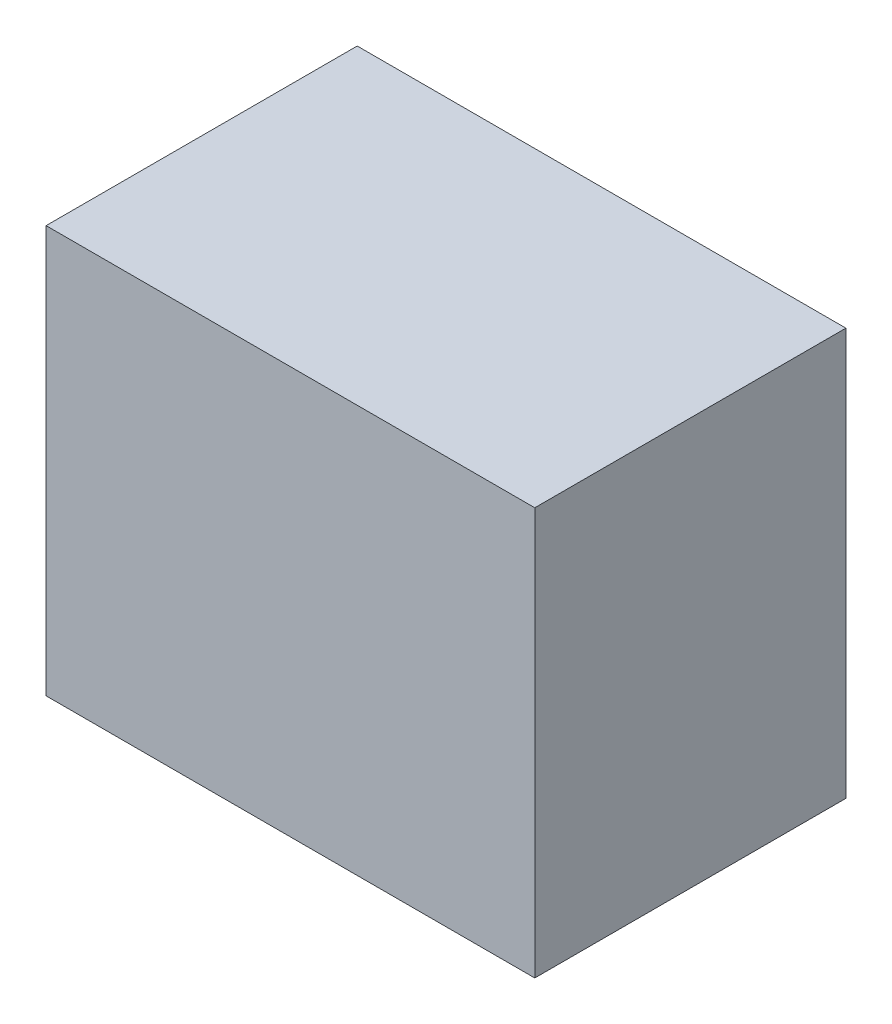
ISO-10303-21;
HEADER;
FILE_DESCRIPTION(('STEP AP214'),'2;1');
FILE_NAME('part.step','',(''),(''),'','','');
FILE_SCHEMA(('AUTOMOTIVE_DESIGN { 1 0 10303 214 1 1 1 1 }'));
ENDSEC;
DATA;
#1=APPLICATION_CONTEXT('core data for automotive mechanical design processes');
#2=APPLICATION_PROTOCOL_DEFINITION('international standard','automotive_design',2000,#1);
#3=PRODUCT_CONTEXT('',#1,'mechanical');
#4=PRODUCT('Part','Part','',(#3));
#5=PRODUCT_RELATED_PRODUCT_CATEGORY('part','',(#4));
#6=PRODUCT_DEFINITION_FORMATION('','',#4);
#7=PRODUCT_DEFINITION_CONTEXT('part definition',#1,'design');
#8=PRODUCT_DEFINITION('design','',#6,#7);
#9=PRODUCT_DEFINITION_SHAPE('','',#8);
#10=(LENGTH_UNIT() NAMED_UNIT(*) SI_UNIT(.MILLI.,.METRE.));
#11=(NAMED_UNIT(*) PLANE_ANGLE_UNIT() SI_UNIT($,.RADIAN.));
#12=(NAMED_UNIT(*) SI_UNIT($,.STERADIAN.) SOLID_ANGLE_UNIT());
#13=UNCERTAINTY_MEASURE_WITH_UNIT(LENGTH_MEASURE(1.E-05),#10,'distance_accuracy_value','');
#14=(GEOMETRIC_REPRESENTATION_CONTEXT(3) GLOBAL_UNCERTAINTY_ASSIGNED_CONTEXT((#13)) GLOBAL_UNIT_ASSIGNED_CONTEXT((#10,
#11,#12)) REPRESENTATION_CONTEXT('',''));
#15=CARTESIAN_POINT('',(0.,0.,0.));
#16=DIRECTION('',(0.,0.,1.));
#17=DIRECTION('',(1.,0.,0.));
#18=AXIS2_PLACEMENT_3D('',#15,#16,#17);
#19=CARTESIAN_POINT('',(0.65,-2.225,2.16));
#20=DIRECTION('',(0.,0.,1.));
#21=DIRECTION('',(1.,0.,0.));
#22=AXIS2_PLACEMENT_3D('',#19,#20,#21);
#23=PLANE('',#22);
#24=DIRECTION('',(0.,1.,0.));
#25=VECTOR('',#24,1.);
#26=CARTESIAN_POINT('',(3.65,-2.225,2.16));
#27=LINE('',#26,#25);
#28=CARTESIAN_POINT('',(3.65,0.275,2.16));
#29=VERTEX_POINT('',#28);
#30=CARTESIAN_POINT('',(3.65,-2.225,2.16));
#31=VERTEX_POINT('',#30);
#32=EDGE_CURVE('E76',#29,#31,#27,.F.);
#33=ORIENTED_EDGE('',*,*,#32,.F.);
#34=DIRECTION('',(1.,0.,0.));
#35=VECTOR('',#34,1.);
#36=CARTESIAN_POINT('',(0.65,0.275,2.16));
#37=LINE('',#36,#35);
#38=CARTESIAN_POINT('',(0.65,0.275,2.16));
#39=VERTEX_POINT('',#38);
#40=EDGE_CURVE('E58',#39,#29,#37,.T.);
#41=ORIENTED_EDGE('',*,*,#40,.F.);
#42=DIRECTION('',(0.,1.,0.));
#43=VECTOR('',#42,1.);
#44=CARTESIAN_POINT('',(0.65,-2.225,2.16));
#45=LINE('',#44,#43);
#46=CARTESIAN_POINT('',(0.65,-2.225,2.16));
#47=VERTEX_POINT('',#46);
#48=EDGE_CURVE('E20',#39,#47,#45,.F.);
#49=ORIENTED_EDGE('',*,*,#48,.T.);
#50=DIRECTION('',(1.,0.,0.));
#51=VECTOR('',#50,1.);
#52=CARTESIAN_POINT('',(0.65,-2.225,2.16));
#53=LINE('',#52,#51);
#54=EDGE_CURVE('E55',#47,#31,#53,.T.);
#55=ORIENTED_EDGE('',*,*,#54,.T.);
#56=EDGE_LOOP('',(#33,#41,#49,#55));
#57=FACE_BOUND('',#56,.T.);
#58=ADVANCED_FACE('F17',(#57),#23,.T.);
#59=CARTESIAN_POINT('',(0.65,-2.225,0.25));
#60=DIRECTION('',(1.,0.,0.));
#61=DIRECTION('',(0.,0.,-1.));
#62=AXIS2_PLACEMENT_3D('',#59,#60,#61);
#63=PLANE('',#62);
#64=DIRECTION('',(0.,0.,1.));
#65=VECTOR('',#64,1.);
#66=CARTESIAN_POINT('',(0.65,0.275,0.25));
#67=LINE('',#66,#65);
#68=CARTESIAN_POINT('',(0.65,0.275,0.25));
#69=VERTEX_POINT('',#68);
#70=EDGE_CURVE('E78',#69,#39,#67,.T.);
#71=ORIENTED_EDGE('',*,*,#70,.F.);
#72=DIRECTION('',(0.,1.,0.));
#73=VECTOR('',#72,1.);
#74=CARTESIAN_POINT('',(0.65,-2.225,0.25));
#75=LINE('',#74,#73);
#76=CARTESIAN_POINT('',(0.65,-2.225,0.25));
#77=VERTEX_POINT('',#76);
#78=EDGE_CURVE('E73',#69,#77,#75,.F.);
#79=ORIENTED_EDGE('',*,*,#78,.T.);
#80=DIRECTION('',(0.,0.,1.));
#81=VECTOR('',#80,1.);
#82=CARTESIAN_POINT('',(0.65,-2.225,0.25));
#83=LINE('',#82,#81);
#84=EDGE_CURVE('E63',#77,#47,#83,.T.);
#85=ORIENTED_EDGE('',*,*,#84,.T.);
#86=ORIENTED_EDGE('',*,*,#48,.F.);
#87=EDGE_LOOP('',(#71,#79,#85,#86));
#88=FACE_BOUND('',#87,.T.);
#89=ADVANCED_FACE('F72',(#88),#63,.F.);
#90=CARTESIAN_POINT('',(0.65,-2.225,0.25));
#91=DIRECTION('',(0.,1.,0.));
#92=DIRECTION('',(0.,0.,1.));
#93=AXIS2_PLACEMENT_3D('',#90,#91,#92);
#94=PLANE('',#93);
#95=ORIENTED_EDGE('',*,*,#54,.F.);
#96=ORIENTED_EDGE('',*,*,#84,.F.);
#97=DIRECTION('',(1.,0.,0.));
#98=VECTOR('',#97,1.);
#99=CARTESIAN_POINT('',(0.65,-2.225,0.25));
#100=LINE('',#99,#98);
#101=CARTESIAN_POINT('',(3.65,-2.225,0.25));
#102=VERTEX_POINT('',#101);
#103=EDGE_CURVE('E83',#77,#102,#100,.T.);
#104=ORIENTED_EDGE('',*,*,#103,.T.);
#105=DIRECTION('',(0.,0.,-1.));
#106=VECTOR('',#105,1.);
#107=CARTESIAN_POINT('',(3.65,-2.225,0.25));
#108=LINE('',#107,#106);
#109=EDGE_CURVE('E69',#31,#102,#108,.T.);
#110=ORIENTED_EDGE('',*,*,#109,.F.);
#111=EDGE_LOOP('',(#95,#96,#104,#110));
#112=FACE_BOUND('',#111,.T.);
#113=ADVANCED_FACE('F66',(#112),#94,.F.);
#114=CARTESIAN_POINT('',(3.65,-2.225,0.25));
#115=DIRECTION('',(1.,0.,0.));
#116=DIRECTION('',(0.,0.,-1.));
#117=AXIS2_PLACEMENT_3D('',#114,#115,#116);
#118=PLANE('',#117);
#119=DIRECTION('',(0.,0.,1.));
#120=VECTOR('',#119,1.);
#121=CARTESIAN_POINT('',(3.65,0.275,0.25));
#122=LINE('',#121,#120);
#123=CARTESIAN_POINT('',(3.65,0.275,0.25));
#124=VERTEX_POINT('',#123);
#125=EDGE_CURVE('E34',#29,#124,#122,.F.);
#126=ORIENTED_EDGE('',*,*,#125,.F.);
#127=ORIENTED_EDGE('',*,*,#32,.T.);
#128=ORIENTED_EDGE('',*,*,#109,.T.);
#129=DIRECTION('',(0.,1.,0.));
#130=VECTOR('',#129,1.);
#131=CARTESIAN_POINT('',(3.65,-2.225,0.25));
#132=LINE('',#131,#130);
#133=EDGE_CURVE('E26',#102,#124,#132,.T.);
#134=ORIENTED_EDGE('',*,*,#133,.T.);
#135=EDGE_LOOP('',(#126,#127,#128,#134));
#136=FACE_BOUND('',#135,.T.);
#137=ADVANCED_FACE('F88',(#136),#118,.T.);
#138=CARTESIAN_POINT('',(0.65,0.275,0.25));
#139=DIRECTION('',(0.,1.,0.));
#140=DIRECTION('',(0.,0.,1.));
#141=AXIS2_PLACEMENT_3D('',#138,#139,#140);
#142=PLANE('',#141);
#143=ORIENTED_EDGE('',*,*,#40,.T.);
#144=ORIENTED_EDGE('',*,*,#125,.T.);
#145=DIRECTION('',(1.,0.,0.));
#146=VECTOR('',#145,1.);
#147=CARTESIAN_POINT('',(0.65,0.275,0.25));
#148=LINE('',#147,#146);
#149=EDGE_CURVE('E11',#124,#69,#148,.F.);
#150=ORIENTED_EDGE('',*,*,#149,.T.);
#151=ORIENTED_EDGE('',*,*,#70,.T.);
#152=EDGE_LOOP('',(#143,#144,#150,#151));
#153=FACE_BOUND('',#152,.T.);
#154=ADVANCED_FACE('F91',(#153),#142,.T.);
#155=CARTESIAN_POINT('',(0.65,-2.225,0.25));
#156=DIRECTION('',(0.,0.,1.));
#157=DIRECTION('',(1.,0.,0.));
#158=AXIS2_PLACEMENT_3D('',#155,#156,#157);
#159=PLANE('',#158);
#160=ORIENTED_EDGE('',*,*,#133,.F.);
#161=ORIENTED_EDGE('',*,*,#103,.F.);
#162=ORIENTED_EDGE('',*,*,#78,.F.);
#163=ORIENTED_EDGE('',*,*,#149,.F.);
#164=EDGE_LOOP('',(#160,#161,#162,#163));
#165=FACE_BOUND('',#164,.T.);
#166=ADVANCED_FACE('F90',(#165),#159,.F.);
#167=CLOSED_SHELL('',(#58,#89,#113,#137,#154,#166));
#168=MANIFOLD_SOLID_BREP('B1',#167);
#169=ADVANCED_BREP_SHAPE_REPRESENTATION('',(#18,#168),#14);
#170=SHAPE_DEFINITION_REPRESENTATION(#9,#169);
ENDSEC;
END-ISO-10303-21;
